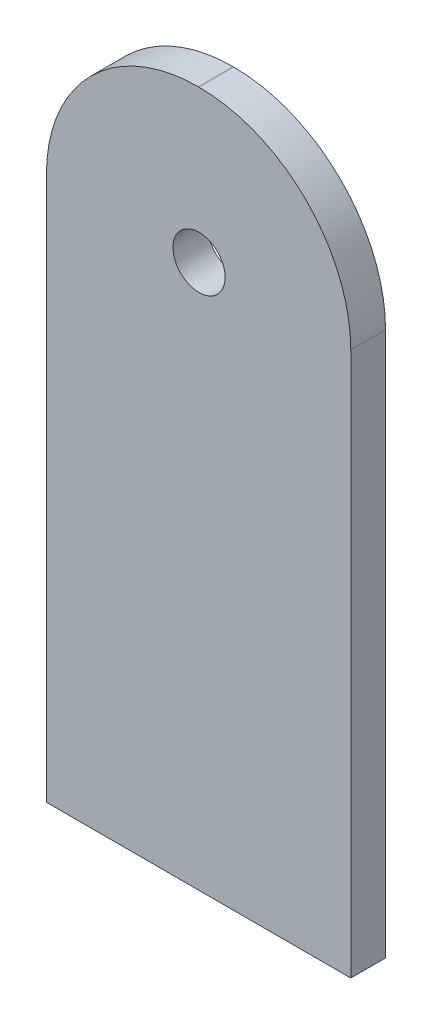
ISO-10303-21;
HEADER;
FILE_DESCRIPTION(('STEP AP214'),'2;1');
FILE_NAME('part.step','',(''),(''),'','','');
FILE_SCHEMA(('AUTOMOTIVE_DESIGN { 1 0 10303 214 1 1 1 1 }'));
ENDSEC;
DATA;
#1=APPLICATION_CONTEXT('core data for automotive mechanical design processes');
#2=APPLICATION_PROTOCOL_DEFINITION('international standard','automotive_design',2000,#1);
#3=PRODUCT_CONTEXT('',#1,'mechanical');
#4=PRODUCT('Part','Part','',(#3));
#5=PRODUCT_RELATED_PRODUCT_CATEGORY('part','',(#4));
#6=PRODUCT_DEFINITION_FORMATION('','',#4);
#7=PRODUCT_DEFINITION_CONTEXT('part definition',#1,'design');
#8=PRODUCT_DEFINITION('design','',#6,#7);
#9=PRODUCT_DEFINITION_SHAPE('','',#8);
#10=(LENGTH_UNIT() NAMED_UNIT(*) SI_UNIT(.MILLI.,.METRE.));
#11=(NAMED_UNIT(*) PLANE_ANGLE_UNIT() SI_UNIT($,.RADIAN.));
#12=(NAMED_UNIT(*) SI_UNIT($,.STERADIAN.) SOLID_ANGLE_UNIT());
#13=UNCERTAINTY_MEASURE_WITH_UNIT(LENGTH_MEASURE(1.E-05),#10,'distance_accuracy_value','');
#14=(GEOMETRIC_REPRESENTATION_CONTEXT(3) GLOBAL_UNCERTAINTY_ASSIGNED_CONTEXT((#13)) GLOBAL_UNIT_ASSIGNED_CONTEXT((#10,
#11,#12)) REPRESENTATION_CONTEXT('',''));
#15=CARTESIAN_POINT('',(0.,0.,0.));
#16=DIRECTION('',(0.,0.,1.));
#17=DIRECTION('',(1.,0.,0.));
#18=AXIS2_PLACEMENT_3D('',#15,#16,#17);
#19=CARTESIAN_POINT('',(-0.0499999999999945,62.55,4.));
#20=DIRECTION('',(0.,0.,-1.));
#21=DIRECTION('',(-1.,0.,0.));
#22=AXIS2_PLACEMENT_3D('',#19,#20,#21);
#23=PLANE('',#22);
#24=DIRECTION('',(0.,-1.,0.));
#25=VECTOR('',#24,1.);
#26=CARTESIAN_POINT('',(-17.5,0.,4.));
#27=LINE('',#26,#25);
#28=CARTESIAN_POINT('',(-17.5,62.5499999999999,3.99999999999998));
#29=VERTEX_POINT('',#28);
#30=CARTESIAN_POINT('',(-17.5,0.,4.));
#31=VERTEX_POINT('',#30);
#32=EDGE_CURVE('E130',#29,#31,#27,.T.);
#33=ORIENTED_EDGE('',*,*,#32,.T.);
#34=DIRECTION('',(1.,0.,0.));
#35=VECTOR('',#34,1.);
#36=CARTESIAN_POINT('',(-17.5,0.,4.));
#37=LINE('',#36,#35);
#38=CARTESIAN_POINT('',(17.5,0.,4.));
#39=VERTEX_POINT('',#38);
#40=EDGE_CURVE('E88',#31,#39,#37,.T.);
#41=ORIENTED_EDGE('',*,*,#40,.T.);
#42=DIRECTION('',(0.,1.,0.));
#43=VECTOR('',#42,1.);
#44=CARTESIAN_POINT('',(17.5,0.,4.));
#45=LINE('',#44,#43);
#46=CARTESIAN_POINT('',(17.5,62.5499999999999,3.99999999999998));
#47=VERTEX_POINT('',#46);
#48=EDGE_CURVE('E101',#39,#47,#45,.T.);
#49=ORIENTED_EDGE('',*,*,#48,.T.);
#50=CARTESIAN_POINT('',(0.0499999999999945,62.55,4.));
#51=DIRECTION('',(0.,0.,1.));
#52=DIRECTION('',(-1.,0.,0.));
#53=AXIS2_PLACEMENT_3D('',#50,#51,#52);
#54=CIRCLE('',#53,17.45);
#55=CARTESIAN_POINT('',(0.0499999999998557,80.,3.99999999999998));
#56=VERTEX_POINT('',#55);
#57=EDGE_CURVE('E95',#47,#56,#54,.T.);
#58=ORIENTED_EDGE('',*,*,#57,.T.);
#59=DIRECTION('',(-1.,0.,0.));
#60=VECTOR('',#59,1.);
#61=CARTESIAN_POINT('',(-0.0499999999999112,80.,3.99999999999998));
#62=LINE('',#61,#60);
#63=CARTESIAN_POINT('',(-0.0499999999999112,80.,3.99999999999998));
#64=VERTEX_POINT('',#63);
#65=EDGE_CURVE('E99',#56,#64,#62,.T.);
#66=ORIENTED_EDGE('',*,*,#65,.T.);
#67=CARTESIAN_POINT('',(-0.0499999999999945,62.55,4.));
#68=DIRECTION('',(0.,0.,1.));
#69=DIRECTION('',(-1.,0.,0.));
#70=AXIS2_PLACEMENT_3D('',#67,#68,#69);
#71=CIRCLE('',#70,17.45);
#72=EDGE_CURVE('E51',#64,#29,#71,.T.);
#73=ORIENTED_EDGE('',*,*,#72,.T.);
#74=EDGE_LOOP('',(#33,#41,#49,#58,#66,#73));
#75=FACE_BOUND('',#74,.T.);
#76=CARTESIAN_POINT('',(0.0499999999999945,62.55,4.));
#77=DIRECTION('',(0.,0.,1.));
#78=DIRECTION('',(1.,0.,0.));
#79=AXIS2_PLACEMENT_3D('',#76,#77,#78);
#80=CIRCLE('',#79,3.);
#81=CARTESIAN_POINT('',(3.05,62.55,4.));
#82=VERTEX_POINT('',#81);
#83=EDGE_CURVE('E123',#82,#82,#80,.T.);
#84=ORIENTED_EDGE('',*,*,#83,.F.);
#85=EDGE_LOOP('',(#84));
#86=FACE_BOUND('',#85,.T.);
#87=ADVANCED_FACE('F34',(#75,#86),#23,.F.);
#88=CARTESIAN_POINT('',(-0.0499999999999945,62.55,0.));
#89=DIRECTION('',(0.,0.,-1.));
#90=DIRECTION('',(-1.,0.,0.));
#91=AXIS2_PLACEMENT_3D('',#88,#89,#90);
#92=PLANE('',#91);
#93=DIRECTION('',(0.,-1.,0.));
#94=VECTOR('',#93,1.);
#95=CARTESIAN_POINT('',(-17.5,0.,0.));
#96=LINE('',#95,#94);
#97=CARTESIAN_POINT('',(-17.5,62.5499999999999,0.));
#98=VERTEX_POINT('',#97);
#99=CARTESIAN_POINT('',(-17.5,0.,0.));
#100=VERTEX_POINT('',#99);
#101=EDGE_CURVE('E119',#98,#100,#96,.T.);
#102=ORIENTED_EDGE('',*,*,#101,.F.);
#103=CARTESIAN_POINT('',(-0.0499999999999945,62.55,0.));
#104=DIRECTION('',(0.,0.,1.));
#105=DIRECTION('',(-1.,0.,0.));
#106=AXIS2_PLACEMENT_3D('',#103,#104,#105);
#107=CIRCLE('',#106,17.45);
#108=CARTESIAN_POINT('',(-0.0499999999999112,80.,0.));
#109=VERTEX_POINT('',#108);
#110=EDGE_CURVE('E80',#109,#98,#107,.T.);
#111=ORIENTED_EDGE('',*,*,#110,.F.);
#112=DIRECTION('',(-1.,0.,0.));
#113=VECTOR('',#112,1.);
#114=CARTESIAN_POINT('',(-0.0499999999999112,80.,0.));
#115=LINE('',#114,#113);
#116=CARTESIAN_POINT('',(0.0499999999998557,80.,0.));
#117=VERTEX_POINT('',#116);
#118=EDGE_CURVE('E74',#117,#109,#115,.T.);
#119=ORIENTED_EDGE('',*,*,#118,.F.);
#120=CARTESIAN_POINT('',(0.0499999999999945,62.55,0.));
#121=DIRECTION('',(0.,0.,1.));
#122=DIRECTION('',(-1.,0.,0.));
#123=AXIS2_PLACEMENT_3D('',#120,#121,#122);
#124=CIRCLE('',#123,17.45);
#125=CARTESIAN_POINT('',(17.5,62.5499999999999,0.));
#126=VERTEX_POINT('',#125);
#127=EDGE_CURVE('E109',#126,#117,#124,.T.);
#128=ORIENTED_EDGE('',*,*,#127,.F.);
#129=DIRECTION('',(0.,1.,0.));
#130=VECTOR('',#129,1.);
#131=CARTESIAN_POINT('',(17.5,0.,0.));
#132=LINE('',#131,#130);
#133=CARTESIAN_POINT('',(17.5,0.,0.));
#134=VERTEX_POINT('',#133);
#135=EDGE_CURVE('E125',#134,#126,#132,.T.);
#136=ORIENTED_EDGE('',*,*,#135,.F.);
#137=DIRECTION('',(1.,0.,0.));
#138=VECTOR('',#137,1.);
#139=CARTESIAN_POINT('',(-17.5,0.,0.));
#140=LINE('',#139,#138);
#141=EDGE_CURVE('E122',#100,#134,#140,.T.);
#142=ORIENTED_EDGE('',*,*,#141,.F.);
#143=EDGE_LOOP('',(#102,#111,#119,#128,#136,#142));
#144=FACE_BOUND('',#143,.T.);
#145=CARTESIAN_POINT('',(0.0499999999999945,62.55,0.));
#146=DIRECTION('',(0.,0.,1.));
#147=DIRECTION('',(1.,0.,0.));
#148=AXIS2_PLACEMENT_3D('',#145,#146,#147);
#149=CIRCLE('',#148,3.);
#150=CARTESIAN_POINT('',(3.05,62.55,0.));
#151=VERTEX_POINT('',#150);
#152=EDGE_CURVE('E223',#151,#151,#149,.T.);
#153=ORIENTED_EDGE('',*,*,#152,.T.);
#154=EDGE_LOOP('',(#153));
#155=FACE_BOUND('',#154,.T.);
#156=ADVANCED_FACE('F139',(#144,#155),#92,.T.);
#157=CARTESIAN_POINT('',(-17.5,0.,4.));
#158=DIRECTION('',(1.,0.,0.));
#159=DIRECTION('',(0.,0.,-1.));
#160=AXIS2_PLACEMENT_3D('',#157,#158,#159);
#161=PLANE('',#160);
#162=ORIENTED_EDGE('',*,*,#101,.T.);
#163=DIRECTION('',(0.,0.,-1.));
#164=VECTOR('',#163,1.);
#165=CARTESIAN_POINT('',(-17.5,0.,4.));
#166=LINE('',#165,#164);
#167=EDGE_CURVE('E11',#31,#100,#166,.T.);
#168=ORIENTED_EDGE('',*,*,#167,.F.);
#169=ORIENTED_EDGE('',*,*,#32,.F.);
#170=DIRECTION('',(0.,0.,-1.));
#171=VECTOR('',#170,1.);
#172=CARTESIAN_POINT('',(-17.5,62.5499999999999,3.99999999999998));
#173=LINE('',#172,#171);
#174=EDGE_CURVE('E115',#29,#98,#173,.T.);
#175=ORIENTED_EDGE('',*,*,#174,.T.);
#176=EDGE_LOOP('',(#162,#168,#169,#175));
#177=FACE_BOUND('',#176,.T.);
#178=ADVANCED_FACE('F36',(#177),#161,.F.);
#179=CARTESIAN_POINT('',(-17.5,0.,4.));
#180=DIRECTION('',(0.,1.,0.));
#181=DIRECTION('',(-1.,0.,0.));
#182=AXIS2_PLACEMENT_3D('',#179,#180,#181);
#183=PLANE('',#182);
#184=ORIENTED_EDGE('',*,*,#141,.T.);
#185=DIRECTION('',(0.,0.,-1.));
#186=VECTOR('',#185,1.);
#187=CARTESIAN_POINT('',(17.5,0.,4.));
#188=LINE('',#187,#186);
#189=EDGE_CURVE('E43',#39,#134,#188,.T.);
#190=ORIENTED_EDGE('',*,*,#189,.F.);
#191=ORIENTED_EDGE('',*,*,#40,.F.);
#192=ORIENTED_EDGE('',*,*,#167,.T.);
#193=EDGE_LOOP('',(#184,#190,#191,#192));
#194=FACE_BOUND('',#193,.T.);
#195=ADVANCED_FACE('F164',(#194),#183,.F.);
#196=CARTESIAN_POINT('',(17.5,0.,4.));
#197=DIRECTION('',(-1.,0.,0.));
#198=DIRECTION('',(0.,-1.,0.));
#199=AXIS2_PLACEMENT_3D('',#196,#197,#198);
#200=PLANE('',#199);
#201=ORIENTED_EDGE('',*,*,#135,.T.);
#202=DIRECTION('',(0.,0.,-1.));
#203=VECTOR('',#202,1.);
#204=CARTESIAN_POINT('',(17.5,62.5499999999999,3.99999999999998));
#205=LINE('',#204,#203);
#206=EDGE_CURVE('E110',#47,#126,#205,.T.);
#207=ORIENTED_EDGE('',*,*,#206,.F.);
#208=ORIENTED_EDGE('',*,*,#48,.F.);
#209=ORIENTED_EDGE('',*,*,#189,.T.);
#210=EDGE_LOOP('',(#201,#207,#208,#209));
#211=FACE_BOUND('',#210,.T.);
#212=ADVANCED_FACE('F136',(#211),#200,.F.);
#213=CARTESIAN_POINT('',(0.0499999999999945,62.55,4.));
#214=DIRECTION('',(0.,0.,-1.));
#215=DIRECTION('',(-1.,0.,0.));
#216=AXIS2_PLACEMENT_3D('',#213,#214,#215);
#217=CYLINDRICAL_SURFACE('',#216,17.45);
#218=ORIENTED_EDGE('',*,*,#127,.T.);
#219=DIRECTION('',(0.,0.,-1.));
#220=VECTOR('',#219,1.);
#221=CARTESIAN_POINT('',(0.0499999999998557,80.,3.99999999999998));
#222=LINE('',#221,#220);
#223=EDGE_CURVE('E106',#56,#117,#222,.T.);
#224=ORIENTED_EDGE('',*,*,#223,.F.);
#225=ORIENTED_EDGE('',*,*,#57,.F.);
#226=ORIENTED_EDGE('',*,*,#206,.T.);
#227=EDGE_LOOP('',(#218,#224,#225,#226));
#228=FACE_BOUND('',#227,.T.);
#229=ADVANCED_FACE('F107',(#228),#217,.T.);
#230=CARTESIAN_POINT('',(-0.0499999999999112,80.,3.99999999999998));
#231=DIRECTION('',(0.,-1.,0.));
#232=DIRECTION('',(0.,0.,-1.));
#233=AXIS2_PLACEMENT_3D('',#230,#231,#232);
#234=PLANE('',#233);
#235=ORIENTED_EDGE('',*,*,#118,.T.);
#236=DIRECTION('',(0.,0.,-1.));
#237=VECTOR('',#236,1.);
#238=CARTESIAN_POINT('',(-0.0499999999999112,80.,3.99999999999998));
#239=LINE('',#238,#237);
#240=EDGE_CURVE('E111',#64,#109,#239,.T.);
#241=ORIENTED_EDGE('',*,*,#240,.F.);
#242=ORIENTED_EDGE('',*,*,#65,.F.);
#243=ORIENTED_EDGE('',*,*,#223,.T.);
#244=EDGE_LOOP('',(#235,#241,#242,#243));
#245=FACE_BOUND('',#244,.T.);
#246=ADVANCED_FACE('F113',(#245),#234,.F.);
#247=CARTESIAN_POINT('',(-0.0499999999999945,62.55,4.));
#248=DIRECTION('',(0.,0.,-1.));
#249=DIRECTION('',(-1.,0.,0.));
#250=AXIS2_PLACEMENT_3D('',#247,#248,#249);
#251=CYLINDRICAL_SURFACE('',#250,17.45);
#252=ORIENTED_EDGE('',*,*,#110,.T.);
#253=ORIENTED_EDGE('',*,*,#174,.F.);
#254=ORIENTED_EDGE('',*,*,#72,.F.);
#255=ORIENTED_EDGE('',*,*,#240,.T.);
#256=EDGE_LOOP('',(#252,#253,#254,#255));
#257=FACE_BOUND('',#256,.T.);
#258=ADVANCED_FACE('F144',(#257),#251,.T.);
#259=CARTESIAN_POINT('',(0.0499999999999945,62.55,4.));
#260=DIRECTION('',(0.,0.,-1.));
#261=DIRECTION('',(-1.,0.,0.));
#262=AXIS2_PLACEMENT_3D('',#259,#260,#261);
#263=CYLINDRICAL_SURFACE('',#262,3.);
#264=ORIENTED_EDGE('',*,*,#83,.T.);
#265=EDGE_LOOP('',(#264));
#266=FACE_BOUND('',#265,.T.);
#267=ORIENTED_EDGE('',*,*,#152,.F.);
#268=EDGE_LOOP('',(#267));
#269=FACE_BOUND('',#268,.T.);
#270=ADVANCED_FACE('F146',(#266,#269),#263,.F.);
#271=CLOSED_SHELL('',(#87,#156,#178,#195,#212,#229,#246,#258,#270));
#272=MANIFOLD_SOLID_BREP('B2',#271);
#273=ADVANCED_BREP_SHAPE_REPRESENTATION('',(#18,#272),#14);
#274=SHAPE_DEFINITION_REPRESENTATION(#9,#273);
ENDSEC;
END-ISO-10303-21;
